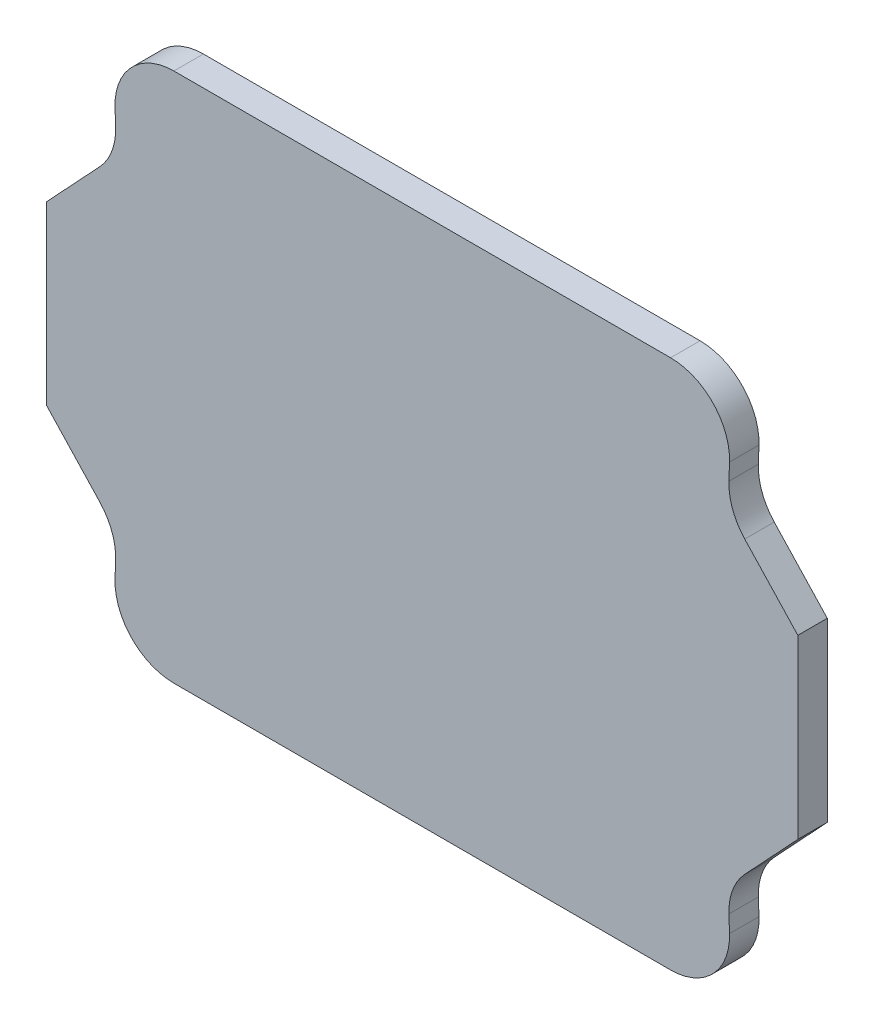
ISO-10303-21;
HEADER;
FILE_DESCRIPTION(('STEP AP214'),'2;1');
FILE_NAME('part.step','',(''),(''),'','','');
FILE_SCHEMA(('AUTOMOTIVE_DESIGN { 1 0 10303 214 1 1 1 1 }'));
ENDSEC;
DATA;
#1=APPLICATION_CONTEXT('core data for automotive mechanical design processes');
#2=APPLICATION_PROTOCOL_DEFINITION('international standard','automotive_design',2000,#1);
#3=PRODUCT_CONTEXT('',#1,'mechanical');
#4=PRODUCT('Part','Part','',(#3));
#5=PRODUCT_RELATED_PRODUCT_CATEGORY('part','',(#4));
#6=PRODUCT_DEFINITION_FORMATION('','',#4);
#7=PRODUCT_DEFINITION_CONTEXT('part definition',#1,'design');
#8=PRODUCT_DEFINITION('design','',#6,#7);
#9=PRODUCT_DEFINITION_SHAPE('','',#8);
#10=(LENGTH_UNIT() NAMED_UNIT(*) SI_UNIT(.MILLI.,.METRE.));
#11=(NAMED_UNIT(*) PLANE_ANGLE_UNIT() SI_UNIT($,.RADIAN.));
#12=(NAMED_UNIT(*) SI_UNIT($,.STERADIAN.) SOLID_ANGLE_UNIT());
#13=UNCERTAINTY_MEASURE_WITH_UNIT(LENGTH_MEASURE(1.E-05),#10,'distance_accuracy_value','');
#14=(GEOMETRIC_REPRESENTATION_CONTEXT(3) GLOBAL_UNCERTAINTY_ASSIGNED_CONTEXT((#13)) GLOBAL_UNIT_ASSIGNED_CONTEXT((#10,
#11,#12)) REPRESENTATION_CONTEXT('',''));
#15=CARTESIAN_POINT('',(0.,0.,0.));
#16=DIRECTION('',(0.,0.,1.));
#17=DIRECTION('',(1.,0.,0.));
#18=AXIS2_PLACEMENT_3D('',#15,#16,#17);
#19=CARTESIAN_POINT('',(266.7,0.,25.4));
#20=DIRECTION('',(-0.999424486660055,-0.033921902427267,0.));
#21=DIRECTION('',(0.033921902427267,-0.999424486660055,0.));
#22=AXIS2_PLACEMENT_3D('',#19,#20,#21);
#23=PLANE('',#22);
#24=DIRECTION('',(-0.033921902427267,0.999424486660055,0.));
#25=VECTOR('',#24,1.);
#26=CARTESIAN_POINT('',(266.7,0.,25.4));
#27=LINE('',#26,#25);
#28=CARTESIAN_POINT('',(264.91728605145,52.5232326433052,25.4));
#29=VERTEX_POINT('',#28);
#30=CARTESIAN_POINT('',(264.425712879151,67.0062135561391,25.4));
#31=VERTEX_POINT('',#30);
#32=EDGE_CURVE('E191',#29,#31,#27,.T.);
#33=ORIENTED_EDGE('',*,*,#32,.F.);
#34=DIRECTION('',(0.,0.,-1.));
#35=VECTOR('',#34,1.);
#36=CARTESIAN_POINT('',(264.91728605145,52.5232326433052,25.4));
#37=LINE('',#36,#35);
#38=CARTESIAN_POINT('',(264.91728605145,52.5232326433052,0.));
#39=VERTEX_POINT('',#38);
#40=EDGE_CURVE('E295',#29,#39,#37,.T.);
#41=ORIENTED_EDGE('',*,*,#40,.T.);
#42=DIRECTION('',(-0.033921902427267,0.999424486660055,0.));
#43=VECTOR('',#42,1.);
#44=CARTESIAN_POINT('',(266.7,0.,0.));
#45=LINE('',#44,#43);
#46=CARTESIAN_POINT('',(264.425712879151,67.0062135561391,0.));
#47=VERTEX_POINT('',#46);
#48=EDGE_CURVE('E242',#39,#47,#45,.T.);
#49=ORIENTED_EDGE('',*,*,#48,.T.);
#50=DIRECTION('',(0.,0.,-1.));
#51=VECTOR('',#50,1.);
#52=CARTESIAN_POINT('',(264.425712879151,67.0062135561391,25.4));
#53=LINE('',#52,#51);
#54=EDGE_CURVE('E201',#47,#31,#53,.F.);
#55=ORIENTED_EDGE('',*,*,#54,.T.);
#56=EDGE_LOOP('',(#33,#41,#49,#55));
#57=FACE_BOUND('',#56,.T.);
#58=ADVANCED_FACE('F39',(#57),#23,.F.);
#59=CARTESIAN_POINT('',(263.71192654717,88.0361525448112,25.4));
#60=DIRECTION('',(-0.730686239038277,0.682713424564142,0.));
#61=DIRECTION('',(-0.682713424564142,-0.730686239038277,0.));
#62=AXIS2_PLACEMENT_3D('',#59,#60,#61);
#63=PLANE('',#62);
#64=DIRECTION('',(0.682713424564142,0.730686239038277,0.));
#65=VECTOR('',#64,1.);
#66=CARTESIAN_POINT('',(263.71192654717,88.0361525448112,25.4));
#67=LINE('',#66,#65);
#68=CARTESIAN_POINT('',(278.077615858337,103.411288167303,25.4));
#69=VERTEX_POINT('',#68);
#70=CARTESIAN_POINT('',(323.85,152.4,25.4));
#71=VERTEX_POINT('',#70);
#72=EDGE_CURVE('E176',#69,#71,#67,.T.);
#73=ORIENTED_EDGE('',*,*,#72,.F.);
#74=DIRECTION('',(0.,0.,-1.));
#75=VECTOR('',#74,1.);
#76=CARTESIAN_POINT('',(278.077615858337,103.411288167303,0.));
#77=LINE('',#76,#75);
#78=CARTESIAN_POINT('',(278.077615858337,103.411288167303,0.));
#79=VERTEX_POINT('',#78);
#80=EDGE_CURVE('E364',#69,#79,#77,.T.);
#81=ORIENTED_EDGE('',*,*,#80,.T.);
#82=DIRECTION('',(0.682713424564142,0.730686239038277,0.));
#83=VECTOR('',#82,1.);
#84=CARTESIAN_POINT('',(263.71192654717,88.0361525448112,0.));
#85=LINE('',#84,#83);
#86=CARTESIAN_POINT('',(323.85,152.4,0.));
#87=VERTEX_POINT('',#86);
#88=EDGE_CURVE('E197',#79,#87,#85,.T.);
#89=ORIENTED_EDGE('',*,*,#88,.T.);
#90=DIRECTION('',(0.,0.,-1.));
#91=VECTOR('',#90,1.);
#92=CARTESIAN_POINT('',(323.85,152.4,25.4));
#93=LINE('',#92,#91);
#94=EDGE_CURVE('E194',#71,#87,#93,.T.);
#95=ORIENTED_EDGE('',*,*,#94,.F.);
#96=EDGE_LOOP('',(#73,#81,#89,#95));
#97=FACE_BOUND('',#96,.T.);
#98=ADVANCED_FACE('F195',(#97),#63,.F.);
#99=CARTESIAN_POINT('',(323.85,152.4,25.4));
#100=DIRECTION('',(-1.,0.,0.));
#101=DIRECTION('',(0.,0.,1.));
#102=AXIS2_PLACEMENT_3D('',#99,#100,#101);
#103=PLANE('',#102);
#104=DIRECTION('',(0.,1.,0.));
#105=VECTOR('',#104,1.);
#106=CARTESIAN_POINT('',(323.85,152.4,0.));
#107=LINE('',#106,#105);
#108=CARTESIAN_POINT('',(323.85,304.8,0.));
#109=VERTEX_POINT('',#108);
#110=EDGE_CURVE('E248',#87,#109,#107,.T.);
#111=ORIENTED_EDGE('',*,*,#110,.T.);
#112=DIRECTION('',(0.,0.,-1.));
#113=VECTOR('',#112,1.);
#114=CARTESIAN_POINT('',(323.85,304.8,25.4));
#115=LINE('',#114,#113);
#116=CARTESIAN_POINT('',(323.85,304.8,25.4));
#117=VERTEX_POINT('',#116);
#118=EDGE_CURVE('E202',#117,#109,#115,.T.);
#119=ORIENTED_EDGE('',*,*,#118,.F.);
#120=DIRECTION('',(0.,1.,0.));
#121=VECTOR('',#120,1.);
#122=CARTESIAN_POINT('',(323.85,152.4,25.4));
#123=LINE('',#122,#121);
#124=EDGE_CURVE('E182',#71,#117,#123,.T.);
#125=ORIENTED_EDGE('',*,*,#124,.F.);
#126=ORIENTED_EDGE('',*,*,#94,.T.);
#127=EDGE_LOOP('',(#111,#119,#125,#126));
#128=FACE_BOUND('',#127,.T.);
#129=ADVANCED_FACE('F204',(#128),#103,.F.);
#130=CARTESIAN_POINT('',(263.71192654717,369.163847455189,25.4));
#131=DIRECTION('',(-0.730686239038277,-0.682713424564142,0.));
#132=DIRECTION('',(0.682713424564142,-0.730686239038277,0.));
#133=AXIS2_PLACEMENT_3D('',#130,#131,#132);
#134=PLANE('',#133);
#135=DIRECTION('',(-0.682713424564142,0.730686239038277,0.));
#136=VECTOR('',#135,1.);
#137=CARTESIAN_POINT('',(263.71192654717,369.163847455189,0.));
#138=LINE('',#137,#136);
#139=CARTESIAN_POINT('',(278.077615858337,353.788711832697,0.));
#140=VERTEX_POINT('',#139);
#141=EDGE_CURVE('E251',#109,#140,#138,.T.);
#142=ORIENTED_EDGE('',*,*,#141,.T.);
#143=DIRECTION('',(0.,0.,-1.));
#144=VECTOR('',#143,1.);
#145=CARTESIAN_POINT('',(278.077615858337,353.788711832697,25.4));
#146=LINE('',#145,#144);
#147=CARTESIAN_POINT('',(278.077615858337,353.788711832697,25.4));
#148=VERTEX_POINT('',#147);
#149=EDGE_CURVE('E367',#140,#148,#146,.F.);
#150=ORIENTED_EDGE('',*,*,#149,.T.);
#151=DIRECTION('',(-0.682713424564142,0.730686239038277,0.));
#152=VECTOR('',#151,1.);
#153=CARTESIAN_POINT('',(263.71192654717,369.163847455189,25.4));
#154=LINE('',#153,#152);
#155=EDGE_CURVE('E208',#117,#148,#154,.T.);
#156=ORIENTED_EDGE('',*,*,#155,.F.);
#157=ORIENTED_EDGE('',*,*,#118,.T.);
#158=EDGE_LOOP('',(#142,#150,#156,#157));
#159=FACE_BOUND('',#158,.T.);
#160=ADVANCED_FACE('F395',(#159),#134,.F.);
#161=CARTESIAN_POINT('',(266.7,457.2,25.4));
#162=DIRECTION('',(-0.999424486660055,0.0339219024272664,0.));
#163=DIRECTION('',(-0.0339219024272664,-0.999424486660055,0.));
#164=AXIS2_PLACEMENT_3D('',#161,#162,#163);
#165=PLANE('',#164);
#166=DIRECTION('',(0.0339219024272664,0.999424486660055,0.));
#167=VECTOR('',#166,1.);
#168=CARTESIAN_POINT('',(266.7,457.2,0.));
#169=LINE('',#168,#167);
#170=CARTESIAN_POINT('',(264.425712879151,390.193786443861,0.));
#171=VERTEX_POINT('',#170);
#172=CARTESIAN_POINT('',(264.91728605145,404.676767356695,0.));
#173=VERTEX_POINT('',#172);
#174=EDGE_CURVE('E255',#171,#173,#169,.T.);
#175=ORIENTED_EDGE('',*,*,#174,.T.);
#176=DIRECTION('',(0.,0.,-1.));
#177=VECTOR('',#176,1.);
#178=CARTESIAN_POINT('',(264.91728605145,404.676767356695,25.4));
#179=LINE('',#178,#177);
#180=CARTESIAN_POINT('',(264.91728605145,404.676767356695,25.4));
#181=VERTEX_POINT('',#180);
#182=EDGE_CURVE('E361',#173,#181,#179,.F.);
#183=ORIENTED_EDGE('',*,*,#182,.T.);
#184=DIRECTION('',(0.0339219024272664,0.999424486660055,0.));
#185=VECTOR('',#184,1.);
#186=CARTESIAN_POINT('',(266.7,457.2,25.4));
#187=LINE('',#186,#185);
#188=CARTESIAN_POINT('',(264.425712879151,390.193786443861,25.4));
#189=VERTEX_POINT('',#188);
#190=EDGE_CURVE('E211',#189,#181,#187,.T.);
#191=ORIENTED_EDGE('',*,*,#190,.F.);
#192=DIRECTION('',(0.,0.,-1.));
#193=VECTOR('',#192,1.);
#194=CARTESIAN_POINT('',(264.425712879151,390.193786443861,0.));
#195=LINE('',#194,#193);
#196=EDGE_CURVE('E357',#189,#171,#195,.T.);
#197=ORIENTED_EDGE('',*,*,#196,.T.);
#198=EDGE_LOOP('',(#175,#183,#191,#197));
#199=FACE_BOUND('',#198,.T.);
#200=ADVANCED_FACE('F400',(#199),#165,.F.);
#201=CARTESIAN_POINT('',(-266.7,457.2,25.4));
#202=DIRECTION('',(0.,-1.,0.));
#203=DIRECTION('',(0.,0.,-1.));
#204=AXIS2_PLACEMENT_3D('',#201,#202,#203);
#205=PLANE('',#204);
#206=DIRECTION('',(-1.,0.,0.));
#207=VECTOR('',#206,1.);
#208=CARTESIAN_POINT('',(-266.7,457.2,0.));
#209=LINE('',#208,#207);
#210=CARTESIAN_POINT('',(214.14652212912,457.2,0.));
#211=VERTEX_POINT('',#210);
#212=CARTESIAN_POINT('',(-214.14652212912,457.2,0.));
#213=VERTEX_POINT('',#212);
#214=EDGE_CURVE('E259',#211,#213,#209,.T.);
#215=ORIENTED_EDGE('',*,*,#214,.T.);
#216=DIRECTION('',(0.,0.,-1.));
#217=VECTOR('',#216,1.);
#218=CARTESIAN_POINT('',(-214.14652212912,457.2,25.4));
#219=LINE('',#218,#217);
#220=CARTESIAN_POINT('',(-214.14652212912,457.2,25.4));
#221=VERTEX_POINT('',#220);
#222=EDGE_CURVE('E354',#213,#221,#219,.F.);
#223=ORIENTED_EDGE('',*,*,#222,.T.);
#224=DIRECTION('',(-1.,0.,0.));
#225=VECTOR('',#224,1.);
#226=CARTESIAN_POINT('',(-266.7,457.2,25.4));
#227=LINE('',#226,#225);
#228=CARTESIAN_POINT('',(214.14652212912,457.2,25.4));
#229=VERTEX_POINT('',#228);
#230=EDGE_CURVE('E218',#229,#221,#227,.T.);
#231=ORIENTED_EDGE('',*,*,#230,.F.);
#232=DIRECTION('',(0.,0.,-1.));
#233=VECTOR('',#232,1.);
#234=CARTESIAN_POINT('',(214.14652212912,457.2,25.4));
#235=LINE('',#234,#233);
#236=EDGE_CURVE('E350',#229,#211,#235,.T.);
#237=ORIENTED_EDGE('',*,*,#236,.T.);
#238=EDGE_LOOP('',(#215,#223,#231,#237));
#239=FACE_BOUND('',#238,.T.);
#240=ADVANCED_FACE('F408',(#239),#205,.F.);
#241=CARTESIAN_POINT('',(-266.7,457.2,25.4));
#242=DIRECTION('',(0.999424486660055,0.0339219024272664,0.));
#243=DIRECTION('',(-0.0339219024272664,0.999424486660055,0.));
#244=AXIS2_PLACEMENT_3D('',#241,#242,#243);
#245=PLANE('',#244);
#246=DIRECTION('',(0.0339219024272664,-0.999424486660055,0.));
#247=VECTOR('',#246,1.);
#248=CARTESIAN_POINT('',(-266.7,457.2,0.));
#249=LINE('',#248,#247);
#250=CARTESIAN_POINT('',(-264.91728605145,404.676767356695,0.));
#251=VERTEX_POINT('',#250);
#252=CARTESIAN_POINT('',(-264.425712879151,390.193786443861,0.));
#253=VERTEX_POINT('',#252);
#254=EDGE_CURVE('E263',#251,#253,#249,.T.);
#255=ORIENTED_EDGE('',*,*,#254,.T.);
#256=DIRECTION('',(0.,0.,-1.));
#257=VECTOR('',#256,1.);
#258=CARTESIAN_POINT('',(-264.425712879151,390.193786443861,25.4));
#259=LINE('',#258,#257);
#260=CARTESIAN_POINT('',(-264.425712879151,390.193786443861,25.4));
#261=VERTEX_POINT('',#260);
#262=EDGE_CURVE('E347',#253,#261,#259,.F.);
#263=ORIENTED_EDGE('',*,*,#262,.T.);
#264=DIRECTION('',(0.0339219024272664,-0.999424486660055,0.));
#265=VECTOR('',#264,1.);
#266=CARTESIAN_POINT('',(-266.7,457.2,25.4));
#267=LINE('',#266,#265);
#268=CARTESIAN_POINT('',(-264.91728605145,404.676767356695,25.4));
#269=VERTEX_POINT('',#268);
#270=EDGE_CURVE('E222',#269,#261,#267,.T.);
#271=ORIENTED_EDGE('',*,*,#270,.F.);
#272=DIRECTION('',(0.,0.,-1.));
#273=VECTOR('',#272,1.);
#274=CARTESIAN_POINT('',(-264.91728605145,404.676767356695,25.4));
#275=LINE('',#274,#273);
#276=EDGE_CURVE('E343',#269,#251,#275,.T.);
#277=ORIENTED_EDGE('',*,*,#276,.T.);
#278=EDGE_LOOP('',(#255,#263,#271,#277));
#279=FACE_BOUND('',#278,.T.);
#280=ADVANCED_FACE('F417',(#279),#245,.F.);
#281=CARTESIAN_POINT('',(-263.71192654717,369.163847455189,25.4));
#282=DIRECTION('',(0.730686239038277,-0.682713424564142,0.));
#283=DIRECTION('',(0.682713424564142,0.730686239038277,0.));
#284=AXIS2_PLACEMENT_3D('',#281,#282,#283);
#285=PLANE('',#284);
#286=DIRECTION('',(-0.682713424564142,-0.730686239038277,0.));
#287=VECTOR('',#286,1.);
#288=CARTESIAN_POINT('',(-263.71192654717,369.163847455189,25.4));
#289=LINE('',#288,#287);
#290=CARTESIAN_POINT('',(-278.077615858337,353.788711832697,25.4));
#291=VERTEX_POINT('',#290);
#292=CARTESIAN_POINT('',(-323.85,304.8,25.4));
#293=VERTEX_POINT('',#292);
#294=EDGE_CURVE('E226',#291,#293,#289,.T.);
#295=ORIENTED_EDGE('',*,*,#294,.F.);
#296=DIRECTION('',(0.,0.,-1.));
#297=VECTOR('',#296,1.);
#298=CARTESIAN_POINT('',(-278.077615858337,353.788711832697,0.));
#299=LINE('',#298,#297);
#300=CARTESIAN_POINT('',(-278.077615858337,353.788711832697,0.));
#301=VERTEX_POINT('',#300);
#302=EDGE_CURVE('E339',#291,#301,#299,.T.);
#303=ORIENTED_EDGE('',*,*,#302,.T.);
#304=DIRECTION('',(-0.682713424564142,-0.730686239038277,0.));
#305=VECTOR('',#304,1.);
#306=CARTESIAN_POINT('',(-263.71192654717,369.163847455189,0.));
#307=LINE('',#306,#305);
#308=CARTESIAN_POINT('',(-323.85,304.8,0.));
#309=VERTEX_POINT('',#308);
#310=EDGE_CURVE('E267',#301,#309,#307,.T.);
#311=ORIENTED_EDGE('',*,*,#310,.T.);
#312=DIRECTION('',(0.,0.,-1.));
#313=VECTOR('',#312,1.);
#314=CARTESIAN_POINT('',(-323.85,304.8,25.4));
#315=LINE('',#314,#313);
#316=EDGE_CURVE('E287',#293,#309,#315,.T.);
#317=ORIENTED_EDGE('',*,*,#316,.F.);
#318=EDGE_LOOP('',(#295,#303,#311,#317));
#319=FACE_BOUND('',#318,.T.);
#320=ADVANCED_FACE('F426',(#319),#285,.F.);
#321=CARTESIAN_POINT('',(-323.85,152.4,25.4));
#322=DIRECTION('',(1.,0.,0.));
#323=DIRECTION('',(0.,0.,-1.));
#324=AXIS2_PLACEMENT_3D('',#321,#322,#323);
#325=PLANE('',#324);
#326=DIRECTION('',(0.,-1.,0.));
#327=VECTOR('',#326,1.);
#328=CARTESIAN_POINT('',(-323.85,152.4,0.));
#329=LINE('',#328,#327);
#330=CARTESIAN_POINT('',(-323.85,152.4,0.));
#331=VERTEX_POINT('',#330);
#332=EDGE_CURVE('E270',#309,#331,#329,.T.);
#333=ORIENTED_EDGE('',*,*,#332,.T.);
#334=DIRECTION('',(0.,0.,-1.));
#335=VECTOR('',#334,1.);
#336=CARTESIAN_POINT('',(-323.85,152.4,25.4));
#337=LINE('',#336,#335);
#338=CARTESIAN_POINT('',(-323.85,152.4,25.4));
#339=VERTEX_POINT('',#338);
#340=EDGE_CURVE('E241',#339,#331,#337,.T.);
#341=ORIENTED_EDGE('',*,*,#340,.F.);
#342=DIRECTION('',(0.,-1.,0.));
#343=VECTOR('',#342,1.);
#344=CARTESIAN_POINT('',(-323.85,152.4,25.4));
#345=LINE('',#344,#343);
#346=EDGE_CURVE('E229',#293,#339,#345,.T.);
#347=ORIENTED_EDGE('',*,*,#346,.F.);
#348=ORIENTED_EDGE('',*,*,#316,.T.);
#349=EDGE_LOOP('',(#333,#341,#347,#348));
#350=FACE_BOUND('',#349,.T.);
#351=ADVANCED_FACE('F432',(#350),#325,.F.);
#352=CARTESIAN_POINT('',(-263.71192654717,88.0361525448112,25.4));
#353=DIRECTION('',(0.730686239038277,0.682713424564142,0.));
#354=DIRECTION('',(-0.682713424564142,0.730686239038277,0.));
#355=AXIS2_PLACEMENT_3D('',#352,#353,#354);
#356=PLANE('',#355);
#357=DIRECTION('',(0.682713424564142,-0.730686239038277,0.));
#358=VECTOR('',#357,1.);
#359=CARTESIAN_POINT('',(-263.71192654717,88.0361525448112,0.));
#360=LINE('',#359,#358);
#361=CARTESIAN_POINT('',(-278.077615858337,103.411288167303,0.));
#362=VERTEX_POINT('',#361);
#363=EDGE_CURVE('E273',#331,#362,#360,.T.);
#364=ORIENTED_EDGE('',*,*,#363,.T.);
#365=DIRECTION('',(0.,0.,-1.));
#366=VECTOR('',#365,1.);
#367=CARTESIAN_POINT('',(-278.077615858337,103.411288167303,25.4));
#368=LINE('',#367,#366);
#369=CARTESIAN_POINT('',(-278.077615858337,103.411288167303,25.4));
#370=VERTEX_POINT('',#369);
#371=EDGE_CURVE('E336',#362,#370,#368,.F.);
#372=ORIENTED_EDGE('',*,*,#371,.T.);
#373=DIRECTION('',(0.682713424564142,-0.730686239038277,0.));
#374=VECTOR('',#373,1.);
#375=CARTESIAN_POINT('',(-263.71192654717,88.0361525448112,25.4));
#376=LINE('',#375,#374);
#377=EDGE_CURVE('E232',#339,#370,#376,.T.);
#378=ORIENTED_EDGE('',*,*,#377,.F.);
#379=ORIENTED_EDGE('',*,*,#340,.T.);
#380=EDGE_LOOP('',(#364,#372,#378,#379));
#381=FACE_BOUND('',#380,.T.);
#382=ADVANCED_FACE('F554',(#381),#356,.F.);
#383=CARTESIAN_POINT('',(-266.7,0.,25.4));
#384=DIRECTION('',(0.999424486660055,-0.0339219024272658,0.));
#385=DIRECTION('',(0.0339219024272658,0.999424486660055,0.));
#386=AXIS2_PLACEMENT_3D('',#383,#384,#385);
#387=PLANE('',#386);
#388=DIRECTION('',(-0.0339219024272658,-0.999424486660055,0.));
#389=VECTOR('',#388,1.);
#390=CARTESIAN_POINT('',(-266.7,0.,0.));
#391=LINE('',#390,#389);
#392=CARTESIAN_POINT('',(-264.425712879151,67.0062135561391,0.));
#393=VERTEX_POINT('',#392);
#394=CARTESIAN_POINT('',(-264.91728605145,52.5232326433051,0.));
#395=VERTEX_POINT('',#394);
#396=EDGE_CURVE('E277',#393,#395,#391,.T.);
#397=ORIENTED_EDGE('',*,*,#396,.T.);
#398=DIRECTION('',(0.,0.,-1.));
#399=VECTOR('',#398,1.);
#400=CARTESIAN_POINT('',(-264.91728605145,52.523232643305,25.4));
#401=LINE('',#400,#399);
#402=CARTESIAN_POINT('',(-264.91728605145,52.5232326433051,25.4));
#403=VERTEX_POINT('',#402);
#404=EDGE_CURVE('E55',#395,#403,#401,.F.);
#405=ORIENTED_EDGE('',*,*,#404,.T.);
#406=DIRECTION('',(-0.0339219024272658,-0.999424486660055,0.));
#407=VECTOR('',#406,1.);
#408=CARTESIAN_POINT('',(-266.7,0.,25.4));
#409=LINE('',#408,#407);
#410=CARTESIAN_POINT('',(-264.425712879151,67.0062135561391,25.4));
#411=VERTEX_POINT('',#410);
#412=EDGE_CURVE('E235',#411,#403,#409,.T.);
#413=ORIENTED_EDGE('',*,*,#412,.F.);
#414=DIRECTION('',(0.,0.,-1.));
#415=VECTOR('',#414,1.);
#416=CARTESIAN_POINT('',(-264.425712879151,67.0062135561391,0.));
#417=LINE('',#416,#415);
#418=EDGE_CURVE('E330',#411,#393,#417,.T.);
#419=ORIENTED_EDGE('',*,*,#418,.T.);
#420=EDGE_LOOP('',(#397,#405,#413,#419));
#421=FACE_BOUND('',#420,.T.);
#422=ADVANCED_FACE('F440',(#421),#387,.F.);
#423=CARTESIAN_POINT('',(-266.7,0.,25.4));
#424=DIRECTION('',(0.,1.,0.));
#425=DIRECTION('',(-1.,0.,0.));
#426=AXIS2_PLACEMENT_3D('',#423,#424,#425);
#427=PLANE('',#426);
#428=DIRECTION('',(1.,0.,0.));
#429=VECTOR('',#428,1.);
#430=CARTESIAN_POINT('',(-266.7,0.,0.));
#431=LINE('',#430,#429);
#432=CARTESIAN_POINT('',(-214.14652212912,0.,0.));
#433=VERTEX_POINT('',#432);
#434=CARTESIAN_POINT('',(214.14652212912,0.,0.));
#435=VERTEX_POINT('',#434);
#436=EDGE_CURVE('E280',#433,#435,#431,.T.);
#437=ORIENTED_EDGE('',*,*,#436,.T.);
#438=DIRECTION('',(0.,0.,-1.));
#439=VECTOR('',#438,1.);
#440=CARTESIAN_POINT('',(214.14652212912,0.,25.4));
#441=LINE('',#440,#439);
#442=CARTESIAN_POINT('',(214.14652212912,0.,25.4));
#443=VERTEX_POINT('',#442);
#444=EDGE_CURVE('E315',#435,#443,#441,.F.);
#445=ORIENTED_EDGE('',*,*,#444,.T.);
#446=DIRECTION('',(1.,0.,0.));
#447=VECTOR('',#446,1.);
#448=CARTESIAN_POINT('',(-266.7,0.,25.4));
#449=LINE('',#448,#447);
#450=CARTESIAN_POINT('',(-214.14652212912,0.,25.4));
#451=VERTEX_POINT('',#450);
#452=EDGE_CURVE('E238',#451,#443,#449,.T.);
#453=ORIENTED_EDGE('',*,*,#452,.F.);
#454=DIRECTION('',(0.,0.,-1.));
#455=VECTOR('',#454,1.);
#456=CARTESIAN_POINT('',(-214.14652212912,0.,25.4));
#457=LINE('',#456,#455);
#458=EDGE_CURVE('E311',#451,#433,#457,.T.);
#459=ORIENTED_EDGE('',*,*,#458,.T.);
#460=EDGE_LOOP('',(#437,#445,#453,#459));
#461=FACE_BOUND('',#460,.T.);
#462=ADVANCED_FACE('F449',(#461),#427,.F.);
#463=CARTESIAN_POINT('',(0.,0.,25.4));
#464=DIRECTION('',(0.,0.,-1.));
#465=DIRECTION('',(-1.,0.,0.));
#466=AXIS2_PLACEMENT_3D('',#463,#464,#465);
#467=PLANE('',#466);
#468=ORIENTED_EDGE('',*,*,#452,.T.);
#469=CARTESIAN_POINT('',(214.14652212912,50.8,25.4));
#470=DIRECTION('',(0.,0.,-1.));
#471=DIRECTION('',(-1.,0.,0.));
#472=AXIS2_PLACEMENT_3D('',#469,#470,#471);
#473=CIRCLE('',#472,50.8);
#474=EDGE_CURVE('E327',#443,#29,#473,.F.);
#475=ORIENTED_EDGE('',*,*,#474,.T.);
#476=ORIENTED_EDGE('',*,*,#32,.T.);
#477=CARTESIAN_POINT('',(315.196476801482,68.7294461994443,25.4));
#478=DIRECTION('',(0.,0.,-1.));
#479=DIRECTION('',(-1.,0.,0.));
#480=AXIS2_PLACEMENT_3D('',#477,#478,#479);
#481=CIRCLE('',#480,50.8);
#482=EDGE_CURVE('E186',#31,#69,#481,.T.);
#483=ORIENTED_EDGE('',*,*,#482,.T.);
#484=ORIENTED_EDGE('',*,*,#72,.T.);
#485=ORIENTED_EDGE('',*,*,#124,.T.);
#486=ORIENTED_EDGE('',*,*,#155,.T.);
#487=CARTESIAN_POINT('',(315.196476801482,388.470553800556,25.4));
#488=DIRECTION('',(0.,0.,-1.));
#489=DIRECTION('',(-1.,0.,0.));
#490=AXIS2_PLACEMENT_3D('',#487,#488,#489);
#491=CIRCLE('',#490,50.8);
#492=EDGE_CURVE('E11',#148,#189,#491,.T.);
#493=ORIENTED_EDGE('',*,*,#492,.T.);
#494=ORIENTED_EDGE('',*,*,#190,.T.);
#495=CARTESIAN_POINT('',(214.14652212912,406.4,25.4));
#496=DIRECTION('',(0.,0.,-1.));
#497=DIRECTION('',(-1.,0.,0.));
#498=AXIS2_PLACEMENT_3D('',#495,#496,#497);
#499=CIRCLE('',#498,50.8);
#500=EDGE_CURVE('E318',#181,#229,#499,.F.);
#501=ORIENTED_EDGE('',*,*,#500,.T.);
#502=ORIENTED_EDGE('',*,*,#230,.T.);
#503=CARTESIAN_POINT('',(-214.14652212912,406.4,25.4));
#504=DIRECTION('',(0.,0.,-1.));
#505=DIRECTION('',(-1.,0.,0.));
#506=AXIS2_PLACEMENT_3D('',#503,#504,#505);
#507=CIRCLE('',#506,50.8);
#508=EDGE_CURVE('E321',#221,#269,#507,.F.);
#509=ORIENTED_EDGE('',*,*,#508,.T.);
#510=ORIENTED_EDGE('',*,*,#270,.T.);
#511=CARTESIAN_POINT('',(-315.196476801482,388.470553800556,25.4));
#512=DIRECTION('',(0.,0.,-1.));
#513=DIRECTION('',(-1.,0.,0.));
#514=AXIS2_PLACEMENT_3D('',#511,#512,#513);
#515=CIRCLE('',#514,50.8);
#516=EDGE_CURVE('E378',#261,#291,#515,.T.);
#517=ORIENTED_EDGE('',*,*,#516,.T.);
#518=ORIENTED_EDGE('',*,*,#294,.T.);
#519=ORIENTED_EDGE('',*,*,#346,.T.);
#520=ORIENTED_EDGE('',*,*,#377,.T.);
#521=CARTESIAN_POINT('',(-315.196476801482,68.7294461994442,25.4));
#522=DIRECTION('',(0.,0.,-1.));
#523=DIRECTION('',(-1.,0.,0.));
#524=AXIS2_PLACEMENT_3D('',#521,#522,#523);
#525=CIRCLE('',#524,50.8);
#526=EDGE_CURVE('E62',#370,#411,#525,.T.);
#527=ORIENTED_EDGE('',*,*,#526,.T.);
#528=ORIENTED_EDGE('',*,*,#412,.T.);
#529=CARTESIAN_POINT('',(-214.14652212912,50.8,25.4));
#530=DIRECTION('',(0.,0.,-1.));
#531=DIRECTION('',(-1.,0.,0.));
#532=AXIS2_PLACEMENT_3D('',#529,#530,#531);
#533=CIRCLE('',#532,50.8);
#534=EDGE_CURVE('E324',#403,#451,#533,.F.);
#535=ORIENTED_EDGE('',*,*,#534,.T.);
#536=EDGE_LOOP('',(#468,#475,#476,#483,#484,#485,#486,#493,#494,#501,#502,#509,#510,#517,#518,
#519,#520,#527,#528,#535));
#537=FACE_BOUND('',#536,.T.);
#538=ADVANCED_FACE('F179',(#537),#467,.F.);
#539=CARTESIAN_POINT('',(0.,0.,0.));
#540=DIRECTION('',(0.,0.,-1.));
#541=DIRECTION('',(-1.,0.,0.));
#542=AXIS2_PLACEMENT_3D('',#539,#540,#541);
#543=PLANE('',#542);
#544=ORIENTED_EDGE('',*,*,#48,.F.);
#545=CARTESIAN_POINT('',(214.14652212912,50.8,0.));
#546=DIRECTION('',(0.,0.,-1.));
#547=DIRECTION('',(-1.,0.,0.));
#548=AXIS2_PLACEMENT_3D('',#545,#546,#547);
#549=CIRCLE('',#548,50.8);
#550=EDGE_CURVE('E308',#39,#435,#549,.T.);
#551=ORIENTED_EDGE('',*,*,#550,.T.);
#552=ORIENTED_EDGE('',*,*,#436,.F.);
#553=CARTESIAN_POINT('',(-214.14652212912,50.8,0.));
#554=DIRECTION('',(0.,0.,-1.));
#555=DIRECTION('',(-1.,0.,0.));
#556=AXIS2_PLACEMENT_3D('',#553,#554,#555);
#557=CIRCLE('',#556,50.8);
#558=EDGE_CURVE('E305',#433,#395,#557,.T.);
#559=ORIENTED_EDGE('',*,*,#558,.T.);
#560=ORIENTED_EDGE('',*,*,#396,.F.);
#561=CARTESIAN_POINT('',(-315.196476801482,68.7294461994442,0.));
#562=DIRECTION('',(0.,0.,-1.));
#563=DIRECTION('',(-1.,0.,0.));
#564=AXIS2_PLACEMENT_3D('',#561,#562,#563);
#565=CIRCLE('',#564,50.8);
#566=EDGE_CURVE('E370',#393,#362,#565,.F.);
#567=ORIENTED_EDGE('',*,*,#566,.T.);
#568=ORIENTED_EDGE('',*,*,#363,.F.);
#569=ORIENTED_EDGE('',*,*,#332,.F.);
#570=ORIENTED_EDGE('',*,*,#310,.F.);
#571=CARTESIAN_POINT('',(-315.196476801482,388.470553800556,0.));
#572=DIRECTION('',(0.,0.,-1.));
#573=DIRECTION('',(-1.,0.,0.));
#574=AXIS2_PLACEMENT_3D('',#571,#572,#573);
#575=CIRCLE('',#574,50.8);
#576=EDGE_CURVE('E375',#301,#253,#575,.F.);
#577=ORIENTED_EDGE('',*,*,#576,.T.);
#578=ORIENTED_EDGE('',*,*,#254,.F.);
#579=CARTESIAN_POINT('',(-214.14652212912,406.4,0.));
#580=DIRECTION('',(0.,0.,-1.));
#581=DIRECTION('',(-1.,0.,0.));
#582=AXIS2_PLACEMENT_3D('',#579,#580,#581);
#583=CIRCLE('',#582,50.8);
#584=EDGE_CURVE('E302',#251,#213,#583,.T.);
#585=ORIENTED_EDGE('',*,*,#584,.T.);
#586=ORIENTED_EDGE('',*,*,#214,.F.);
#587=CARTESIAN_POINT('',(214.14652212912,406.4,0.));
#588=DIRECTION('',(0.,0.,-1.));
#589=DIRECTION('',(-1.,0.,0.));
#590=AXIS2_PLACEMENT_3D('',#587,#588,#589);
#591=CIRCLE('',#590,50.8);
#592=EDGE_CURVE('E299',#211,#173,#591,.T.);
#593=ORIENTED_EDGE('',*,*,#592,.T.);
#594=ORIENTED_EDGE('',*,*,#174,.F.);
#595=CARTESIAN_POINT('',(315.196476801482,388.470553800556,0.));
#596=DIRECTION('',(0.,0.,-1.));
#597=DIRECTION('',(-1.,0.,0.));
#598=AXIS2_PLACEMENT_3D('',#595,#596,#597);
#599=CIRCLE('',#598,50.8);
#600=EDGE_CURVE('E48',#171,#140,#599,.F.);
#601=ORIENTED_EDGE('',*,*,#600,.T.);
#602=ORIENTED_EDGE('',*,*,#141,.F.);
#603=ORIENTED_EDGE('',*,*,#110,.F.);
#604=ORIENTED_EDGE('',*,*,#88,.F.);
#605=CARTESIAN_POINT('',(315.196476801482,68.7294461994443,0.));
#606=DIRECTION('',(0.,0.,-1.));
#607=DIRECTION('',(-1.,0.,0.));
#608=AXIS2_PLACEMENT_3D('',#605,#606,#607);
#609=CIRCLE('',#608,50.8);
#610=EDGE_CURVE('E381',#79,#47,#609,.F.);
#611=ORIENTED_EDGE('',*,*,#610,.T.);
#612=EDGE_LOOP('',(#544,#551,#552,#559,#560,#567,#568,#569,#570,#577,#578,#585,#586,#593,#594,
#601,#602,#603,#604,#611));
#613=FACE_BOUND('',#612,.T.);
#614=ADVANCED_FACE('F390',(#613),#543,.T.);
#615=CARTESIAN_POINT('',(214.14652212912,50.8,25.4));
#616=DIRECTION('',(0.,0.,-1.));
#617=DIRECTION('',(-1.,0.,0.));
#618=AXIS2_PLACEMENT_3D('',#615,#616,#617);
#619=CYLINDRICAL_SURFACE('',#618,50.8);
#620=ORIENTED_EDGE('',*,*,#474,.F.);
#621=ORIENTED_EDGE('',*,*,#444,.F.);
#622=ORIENTED_EDGE('',*,*,#550,.F.);
#623=ORIENTED_EDGE('',*,*,#40,.F.);
#624=EDGE_LOOP('',(#620,#621,#622,#623));
#625=FACE_BOUND('',#624,.T.);
#626=ADVANCED_FACE('F455',(#625),#619,.T.);
#627=CARTESIAN_POINT('',(-214.14652212912,50.8,25.4));
#628=DIRECTION('',(0.,0.,-1.));
#629=DIRECTION('',(-1.,0.,0.));
#630=AXIS2_PLACEMENT_3D('',#627,#628,#629);
#631=CYLINDRICAL_SURFACE('',#630,50.8);
#632=ORIENTED_EDGE('',*,*,#534,.F.);
#633=ORIENTED_EDGE('',*,*,#404,.F.);
#634=ORIENTED_EDGE('',*,*,#558,.F.);
#635=ORIENTED_EDGE('',*,*,#458,.F.);
#636=EDGE_LOOP('',(#632,#633,#634,#635));
#637=FACE_BOUND('',#636,.T.);
#638=ADVANCED_FACE('F446',(#637),#631,.T.);
#639=CARTESIAN_POINT('',(-315.196476801482,68.7294461994442,25.4));
#640=DIRECTION('',(0.,0.,1.));
#641=DIRECTION('',(1.,0.,0.));
#642=AXIS2_PLACEMENT_3D('',#639,#640,#641);
#643=CYLINDRICAL_SURFACE('',#642,50.8);
#644=ORIENTED_EDGE('',*,*,#526,.F.);
#645=ORIENTED_EDGE('',*,*,#371,.F.);
#646=ORIENTED_EDGE('',*,*,#566,.F.);
#647=ORIENTED_EDGE('',*,*,#418,.F.);
#648=EDGE_LOOP('',(#644,#645,#646,#647));
#649=FACE_BOUND('',#648,.T.);
#650=ADVANCED_FACE('F438',(#649),#643,.F.);
#651=CARTESIAN_POINT('',(-315.196476801482,388.470553800556,25.4));
#652=DIRECTION('',(0.,0.,1.));
#653=DIRECTION('',(1.,0.,0.));
#654=AXIS2_PLACEMENT_3D('',#651,#652,#653);
#655=CYLINDRICAL_SURFACE('',#654,50.8);
#656=ORIENTED_EDGE('',*,*,#516,.F.);
#657=ORIENTED_EDGE('',*,*,#262,.F.);
#658=ORIENTED_EDGE('',*,*,#576,.F.);
#659=ORIENTED_EDGE('',*,*,#302,.F.);
#660=EDGE_LOOP('',(#656,#657,#658,#659));
#661=FACE_BOUND('',#660,.T.);
#662=ADVANCED_FACE('F421',(#661),#655,.F.);
#663=CARTESIAN_POINT('',(-214.14652212912,406.4,25.4));
#664=DIRECTION('',(0.,0.,-1.));
#665=DIRECTION('',(-1.,0.,0.));
#666=AXIS2_PLACEMENT_3D('',#663,#664,#665);
#667=CYLINDRICAL_SURFACE('',#666,50.8);
#668=ORIENTED_EDGE('',*,*,#508,.F.);
#669=ORIENTED_EDGE('',*,*,#222,.F.);
#670=ORIENTED_EDGE('',*,*,#584,.F.);
#671=ORIENTED_EDGE('',*,*,#276,.F.);
#672=EDGE_LOOP('',(#668,#669,#670,#671));
#673=FACE_BOUND('',#672,.T.);
#674=ADVANCED_FACE('F412',(#673),#667,.T.);
#675=CARTESIAN_POINT('',(214.14652212912,406.4,25.4));
#676=DIRECTION('',(0.,0.,-1.));
#677=DIRECTION('',(-1.,0.,0.));
#678=AXIS2_PLACEMENT_3D('',#675,#676,#677);
#679=CYLINDRICAL_SURFACE('',#678,50.8);
#680=ORIENTED_EDGE('',*,*,#500,.F.);
#681=ORIENTED_EDGE('',*,*,#182,.F.);
#682=ORIENTED_EDGE('',*,*,#592,.F.);
#683=ORIENTED_EDGE('',*,*,#236,.F.);
#684=EDGE_LOOP('',(#680,#681,#682,#683));
#685=FACE_BOUND('',#684,.T.);
#686=ADVANCED_FACE('F403',(#685),#679,.T.);
#687=CARTESIAN_POINT('',(315.196476801482,68.7294461994443,25.4));
#688=DIRECTION('',(0.,0.,1.));
#689=DIRECTION('',(1.,0.,0.));
#690=AXIS2_PLACEMENT_3D('',#687,#688,#689);
#691=CYLINDRICAL_SURFACE('',#690,50.8);
#692=ORIENTED_EDGE('',*,*,#482,.F.);
#693=ORIENTED_EDGE('',*,*,#54,.F.);
#694=ORIENTED_EDGE('',*,*,#610,.F.);
#695=ORIENTED_EDGE('',*,*,#80,.F.);
#696=EDGE_LOOP('',(#692,#693,#694,#695));
#697=FACE_BOUND('',#696,.T.);
#698=ADVANCED_FACE('F459',(#697),#691,.F.);
#699=CARTESIAN_POINT('',(315.196476801482,388.470553800556,25.4));
#700=DIRECTION('',(0.,0.,1.));
#701=DIRECTION('',(1.,0.,0.));
#702=AXIS2_PLACEMENT_3D('',#699,#700,#701);
#703=CYLINDRICAL_SURFACE('',#702,50.8);
#704=ORIENTED_EDGE('',*,*,#492,.F.);
#705=ORIENTED_EDGE('',*,*,#149,.F.);
#706=ORIENTED_EDGE('',*,*,#600,.F.);
#707=ORIENTED_EDGE('',*,*,#196,.F.);
#708=EDGE_LOOP('',(#704,#705,#706,#707));
#709=FACE_BOUND('',#708,.T.);
#710=ADVANCED_FACE('F41',(#709),#703,.F.);
#711=CLOSED_SHELL('',(#58,#98,#129,#160,#200,#240,#280,#320,#351,#382,#422,#462,#538,#614,#626,
#638,#650,#662,#674,#686,#698,#710));
#712=MANIFOLD_SOLID_BREP('B2',#711);
#713=ADVANCED_BREP_SHAPE_REPRESENTATION('',(#18,#712),#14);
#714=SHAPE_DEFINITION_REPRESENTATION(#9,#713);
ENDSEC;
END-ISO-10303-21;
